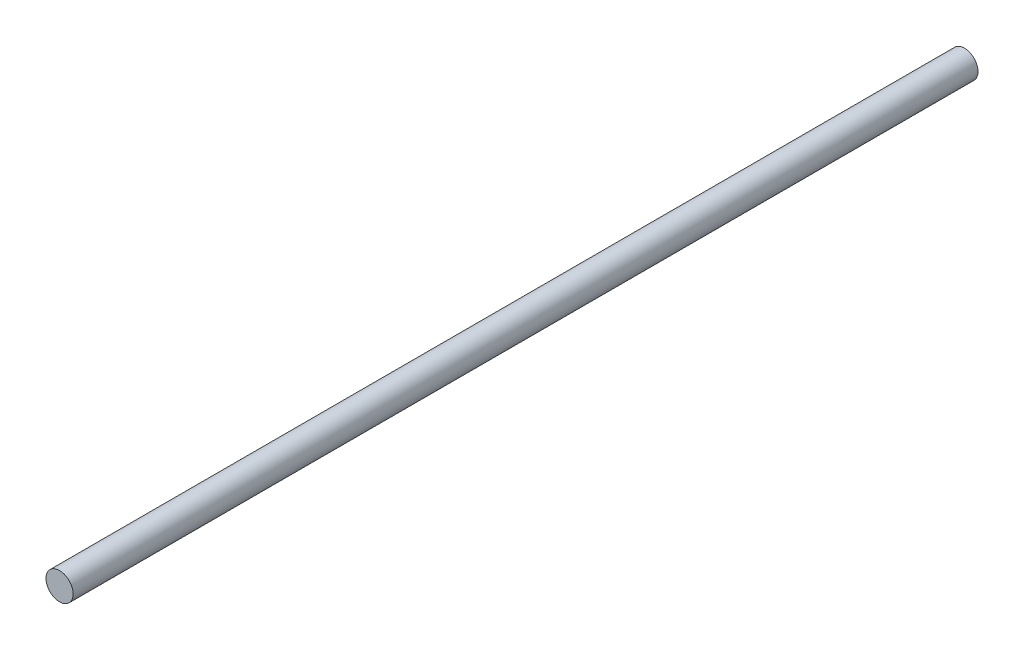
ISO-10303-21;
HEADER;
FILE_DESCRIPTION(('STEP AP214'),'2;1');
FILE_NAME('part.step','',(''),(''),'','','');
FILE_SCHEMA(('AUTOMOTIVE_DESIGN { 1 0 10303 214 1 1 1 1 }'));
ENDSEC;
DATA;
#1=APPLICATION_CONTEXT('core data for automotive mechanical design processes');
#2=APPLICATION_PROTOCOL_DEFINITION('international standard','automotive_design',2000,#1);
#3=PRODUCT_CONTEXT('',#1,'mechanical');
#4=PRODUCT('Part','Part','',(#3));
#5=PRODUCT_RELATED_PRODUCT_CATEGORY('part','',(#4));
#6=PRODUCT_DEFINITION_FORMATION('','',#4);
#7=PRODUCT_DEFINITION_CONTEXT('part definition',#1,'design');
#8=PRODUCT_DEFINITION('design','',#6,#7);
#9=PRODUCT_DEFINITION_SHAPE('','',#8);
#10=(LENGTH_UNIT() NAMED_UNIT(*) SI_UNIT(.MILLI.,.METRE.));
#11=(NAMED_UNIT(*) PLANE_ANGLE_UNIT() SI_UNIT($,.RADIAN.));
#12=(NAMED_UNIT(*) SI_UNIT($,.STERADIAN.) SOLID_ANGLE_UNIT());
#13=UNCERTAINTY_MEASURE_WITH_UNIT(LENGTH_MEASURE(1.E-05),#10,'distance_accuracy_value','');
#14=(GEOMETRIC_REPRESENTATION_CONTEXT(3) GLOBAL_UNCERTAINTY_ASSIGNED_CONTEXT((#13)) GLOBAL_UNIT_ASSIGNED_CONTEXT((#10,
#11,#12)) REPRESENTATION_CONTEXT('',''));
#15=CARTESIAN_POINT('',(0.,0.,0.));
#16=DIRECTION('',(0.,0.,1.));
#17=DIRECTION('',(1.,0.,0.));
#18=AXIS2_PLACEMENT_3D('',#15,#16,#17);
#19=CARTESIAN_POINT('',(0.,0.,200.));
#20=DIRECTION('',(0.,0.,-1.));
#21=DIRECTION('',(-1.,0.,0.));
#22=AXIS2_PLACEMENT_3D('',#19,#20,#21);
#23=CYLINDRICAL_SURFACE('',#22,3.);
#24=CARTESIAN_POINT('',(0.,0.,200.));
#25=DIRECTION('',(0.,0.,1.));
#26=DIRECTION('',(1.,0.,0.));
#27=AXIS2_PLACEMENT_3D('',#24,#25,#26);
#28=CIRCLE('',#27,3.);
#29=CARTESIAN_POINT('',(3.,0.,200.));
#30=VERTEX_POINT('',#29);
#31=EDGE_CURVE('E10',#30,#30,#28,.T.);
#32=ORIENTED_EDGE('',*,*,#31,.F.);
#33=EDGE_LOOP('',(#32));
#34=FACE_BOUND('',#33,.T.);
#35=CARTESIAN_POINT('',(0.,0.,0.));
#36=DIRECTION('',(0.,0.,1.));
#37=DIRECTION('',(1.,0.,0.));
#38=AXIS2_PLACEMENT_3D('',#35,#36,#37);
#39=CIRCLE('',#38,3.);
#40=CARTESIAN_POINT('',(3.,0.,0.));
#41=VERTEX_POINT('',#40);
#42=EDGE_CURVE('E40',#41,#41,#39,.T.);
#43=ORIENTED_EDGE('',*,*,#42,.T.);
#44=EDGE_LOOP('',(#43));
#45=FACE_BOUND('',#44,.T.);
#46=ADVANCED_FACE('F37',(#34,#45),#23,.T.);
#47=CARTESIAN_POINT('',(0.,0.,200.));
#48=DIRECTION('',(0.,0.,1.));
#49=DIRECTION('',(1.,0.,0.));
#50=AXIS2_PLACEMENT_3D('',#47,#48,#49);
#51=PLANE('',#50);
#52=ORIENTED_EDGE('',*,*,#31,.T.);
#53=EDGE_LOOP('',(#52));
#54=FACE_BOUND('',#53,.T.);
#55=ADVANCED_FACE('F54',(#54),#51,.T.);
#56=CARTESIAN_POINT('',(0.,0.,0.));
#57=DIRECTION('',(0.,0.,1.));
#58=DIRECTION('',(1.,0.,0.));
#59=AXIS2_PLACEMENT_3D('',#56,#57,#58);
#60=PLANE('',#59);
#61=ORIENTED_EDGE('',*,*,#42,.F.);
#62=EDGE_LOOP('',(#61));
#63=FACE_BOUND('',#62,.T.);
#64=ADVANCED_FACE('F52',(#63),#60,.F.);
#65=CLOSED_SHELL('',(#46,#55,#64));
#66=MANIFOLD_SOLID_BREP('B2',#65);
#67=ADVANCED_BREP_SHAPE_REPRESENTATION('',(#18,#66),#14);
#68=SHAPE_DEFINITION_REPRESENTATION(#9,#67);
ENDSEC;
END-ISO-10303-21;
